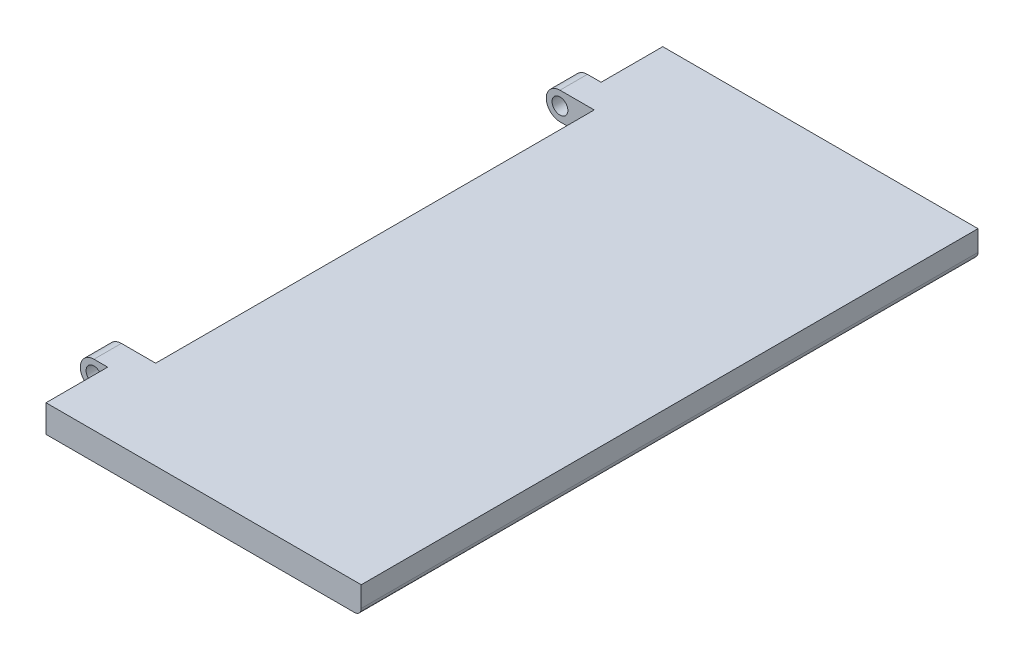
ISO-10303-21;
HEADER;
FILE_DESCRIPTION(('STEP AP214'),'2;1');
FILE_NAME('part.step','',(''),(''),'','','');
FILE_SCHEMA(('AUTOMOTIVE_DESIGN { 1 0 10303 214 1 1 1 1 }'));
ENDSEC;
DATA;
#1=APPLICATION_CONTEXT('core data for automotive mechanical design processes');
#2=APPLICATION_PROTOCOL_DEFINITION('international standard','automotive_design',2000,#1);
#3=PRODUCT_CONTEXT('',#1,'mechanical');
#4=PRODUCT('Part','Part','',(#3));
#5=PRODUCT_RELATED_PRODUCT_CATEGORY('part','',(#4));
#6=PRODUCT_DEFINITION_FORMATION('','',#4);
#7=PRODUCT_DEFINITION_CONTEXT('part definition',#1,'design');
#8=PRODUCT_DEFINITION('design','',#6,#7);
#9=PRODUCT_DEFINITION_SHAPE('','',#8);
#10=(LENGTH_UNIT() NAMED_UNIT(*) SI_UNIT(.MILLI.,.METRE.));
#11=(NAMED_UNIT(*) PLANE_ANGLE_UNIT() SI_UNIT($,.RADIAN.));
#12=(NAMED_UNIT(*) SI_UNIT($,.STERADIAN.) SOLID_ANGLE_UNIT());
#13=UNCERTAINTY_MEASURE_WITH_UNIT(LENGTH_MEASURE(1.E-05),#10,'distance_accuracy_value','');
#14=(GEOMETRIC_REPRESENTATION_CONTEXT(3) GLOBAL_UNCERTAINTY_ASSIGNED_CONTEXT((#13)) GLOBAL_UNIT_ASSIGNED_CONTEXT((#10,
#11,#12)) REPRESENTATION_CONTEXT('',''));
#15=CARTESIAN_POINT('',(0.,0.,0.));
#16=DIRECTION('',(0.,0.,1.));
#17=DIRECTION('',(1.,0.,0.));
#18=AXIS2_PLACEMENT_3D('',#15,#16,#17);
#19=CARTESIAN_POINT('',(0.,0.,90.));
#20=DIRECTION('',(-1.,0.,0.));
#21=DIRECTION('',(0.,0.,1.));
#22=AXIS2_PLACEMENT_3D('',#19,#20,#21);
#23=PLANE('',#22);
#24=DIRECTION('',(0.,-1.,0.));
#25=VECTOR('',#24,1.);
#26=CARTESIAN_POINT('',(0.,4.,77.));
#27=LINE('',#26,#25);
#28=CARTESIAN_POINT('',(0.,0.999999999999998,77.));
#29=VERTEX_POINT('',#28);
#30=CARTESIAN_POINT('',(0.,0.,77.));
#31=VERTEX_POINT('',#30);
#32=EDGE_CURVE('E171',#29,#31,#27,.T.);
#33=ORIENTED_EDGE('',*,*,#32,.F.);
#34=DIRECTION('',(0.,0.,-1.));
#35=VECTOR('',#34,1.);
#36=CARTESIAN_POINT('',(0.,0.999999999999999,90.));
#37=LINE('',#36,#35);
#38=CARTESIAN_POINT('',(0.,0.999999999999998,13.));
#39=VERTEX_POINT('',#38);
#40=EDGE_CURVE('E238',#29,#39,#37,.T.);
#41=ORIENTED_EDGE('',*,*,#40,.T.);
#42=DIRECTION('',(0.,-1.,0.));
#43=VECTOR('',#42,1.);
#44=CARTESIAN_POINT('',(0.,4.,13.));
#45=LINE('',#44,#43);
#46=CARTESIAN_POINT('',(0.,0.,13.));
#47=VERTEX_POINT('',#46);
#48=EDGE_CURVE('E213',#39,#47,#45,.T.);
#49=ORIENTED_EDGE('',*,*,#48,.T.);
#50=DIRECTION('',(0.,0.,-1.));
#51=VECTOR('',#50,1.);
#52=CARTESIAN_POINT('',(0.,0.,90.));
#53=LINE('',#52,#51);
#54=EDGE_CURVE('E180',#31,#47,#53,.T.);
#55=ORIENTED_EDGE('',*,*,#54,.F.);
#56=EDGE_LOOP('',(#33,#41,#49,#55));
#57=FACE_BOUND('',#56,.T.);
#58=ADVANCED_FACE('F37',(#57),#23,.T.);
#59=DIRECTION('',(0.,-1.,0.));
#60=VECTOR('',#59,1.);
#61=CARTESIAN_POINT('',(0.,4.,81.));
#62=LINE('',#61,#60);
#63=CARTESIAN_POINT('',(0.,4.,81.));
#64=VERTEX_POINT('',#63);
#65=CARTESIAN_POINT('',(0.,0.,81.));
#66=VERTEX_POINT('',#65);
#67=EDGE_CURVE('E155',#64,#66,#62,.T.);
#68=ORIENTED_EDGE('',*,*,#67,.T.);
#69=CARTESIAN_POINT('',(0.,0.,90.));
#70=VERTEX_POINT('',#69);
#71=EDGE_CURVE('E168',#70,#66,#53,.T.);
#72=ORIENTED_EDGE('',*,*,#71,.F.);
#73=DIRECTION('',(0.,1.,0.));
#74=VECTOR('',#73,1.);
#75=CARTESIAN_POINT('',(0.,0.,90.));
#76=LINE('',#75,#74);
#77=CARTESIAN_POINT('',(0.,4.,90.));
#78=VERTEX_POINT('',#77);
#79=EDGE_CURVE('E190',#70,#78,#76,.T.);
#80=ORIENTED_EDGE('',*,*,#79,.T.);
#81=DIRECTION('',(0.,0.,-1.));
#82=VECTOR('',#81,1.);
#83=CARTESIAN_POINT('',(0.,4.,90.));
#84=LINE('',#83,#82);
#85=EDGE_CURVE('E170',#78,#64,#84,.T.);
#86=ORIENTED_EDGE('',*,*,#85,.T.);
#87=EDGE_LOOP('',(#68,#72,#80,#86));
#88=FACE_BOUND('',#87,.T.);
#89=ADVANCED_FACE('F166',(#88),#23,.T.);
#90=CARTESIAN_POINT('',(0.,4.,90.));
#91=DIRECTION('',(0.,1.,0.));
#92=DIRECTION('',(0.,0.,1.));
#93=AXIS2_PLACEMENT_3D('',#90,#91,#92);
#94=PLANE('',#93);
#95=DIRECTION('',(1.,0.,0.));
#96=VECTOR('',#95,1.);
#97=CARTESIAN_POINT('',(-4.,4.,13.));
#98=LINE('',#97,#96);
#99=CARTESIAN_POINT('',(-2.,4.,13.));
#100=VERTEX_POINT('',#99);
#101=CARTESIAN_POINT('',(3.00000000000001,4.,13.));
#102=VERTEX_POINT('',#101);
#103=EDGE_CURVE('E53',#100,#102,#98,.T.);
#104=ORIENTED_EDGE('',*,*,#103,.T.);
#105=DIRECTION('',(0.,0.,1.));
#106=VECTOR('',#105,1.);
#107=CARTESIAN_POINT('',(3.00000000000001,4.,90.));
#108=LINE('',#107,#106);
#109=CARTESIAN_POINT('',(3.00000000000001,4.,77.));
#110=VERTEX_POINT('',#109);
#111=EDGE_CURVE('E241',#102,#110,#108,.T.);
#112=ORIENTED_EDGE('',*,*,#111,.T.);
#113=DIRECTION('',(1.,0.,0.));
#114=VECTOR('',#113,1.);
#115=CARTESIAN_POINT('',(-4.,4.,77.));
#116=LINE('',#115,#114);
#117=CARTESIAN_POINT('',(-2.,4.,77.));
#118=VERTEX_POINT('',#117);
#119=EDGE_CURVE('E60',#118,#110,#116,.T.);
#120=ORIENTED_EDGE('',*,*,#119,.F.);
#121=DIRECTION('',(0.,0.,-1.));
#122=VECTOR('',#121,1.);
#123=CARTESIAN_POINT('',(-2.,4.,81.));
#124=LINE('',#123,#122);
#125=CARTESIAN_POINT('',(-2.,4.,81.));
#126=VERTEX_POINT('',#125);
#127=EDGE_CURVE('E218',#118,#126,#124,.F.);
#128=ORIENTED_EDGE('',*,*,#127,.T.);
#129=DIRECTION('',(1.,0.,0.));
#130=VECTOR('',#129,1.);
#131=CARTESIAN_POINT('',(-4.,4.,81.));
#132=LINE('',#131,#130);
#133=EDGE_CURVE('E163',#126,#64,#132,.T.);
#134=ORIENTED_EDGE('',*,*,#133,.T.);
#135=ORIENTED_EDGE('',*,*,#85,.F.);
#136=DIRECTION('',(1.,0.,0.));
#137=VECTOR('',#136,1.);
#138=CARTESIAN_POINT('',(0.,4.,90.));
#139=LINE('',#138,#137);
#140=CARTESIAN_POINT('',(46.,4.,90.));
#141=VERTEX_POINT('',#140);
#142=EDGE_CURVE('E286',#78,#141,#139,.T.);
#143=ORIENTED_EDGE('',*,*,#142,.T.);
#144=DIRECTION('',(0.,0.,-1.));
#145=VECTOR('',#144,1.);
#146=CARTESIAN_POINT('',(46.,4.,90.));
#147=LINE('',#146,#145);
#148=CARTESIAN_POINT('',(46.,4.,0.));
#149=VERTEX_POINT('',#148);
#150=EDGE_CURVE('E186',#141,#149,#147,.T.);
#151=ORIENTED_EDGE('',*,*,#150,.T.);
#152=DIRECTION('',(1.,0.,0.));
#153=VECTOR('',#152,1.);
#154=CARTESIAN_POINT('',(0.,4.,0.));
#155=LINE('',#154,#153);
#156=CARTESIAN_POINT('',(0.,4.,0.));
#157=VERTEX_POINT('',#156);
#158=EDGE_CURVE('E285',#157,#149,#155,.T.);
#159=ORIENTED_EDGE('',*,*,#158,.F.);
#160=CARTESIAN_POINT('',(0.,4.,8.99999999999999));
#161=VERTEX_POINT('',#160);
#162=EDGE_CURVE('E179',#161,#157,#84,.T.);
#163=ORIENTED_EDGE('',*,*,#162,.F.);
#164=DIRECTION('',(1.,0.,0.));
#165=VECTOR('',#164,1.);
#166=CARTESIAN_POINT('',(-4.,4.,8.99999999999999));
#167=LINE('',#166,#165);
#168=CARTESIAN_POINT('',(-2.,4.,8.99999999999999));
#169=VERTEX_POINT('',#168);
#170=EDGE_CURVE('E280',#169,#161,#167,.T.);
#171=ORIENTED_EDGE('',*,*,#170,.F.);
#172=DIRECTION('',(0.,0.,1.));
#173=VECTOR('',#172,1.);
#174=CARTESIAN_POINT('',(-2.,4.,13.));
#175=LINE('',#174,#173);
#176=EDGE_CURVE('E197',#169,#100,#175,.T.);
#177=ORIENTED_EDGE('',*,*,#176,.T.);
#178=EDGE_LOOP('',(#104,#112,#120,#128,#134,#135,#143,#151,#159,#163,#171,#177));
#179=FACE_BOUND('',#178,.T.);
#180=ADVANCED_FACE('F250',(#179),#94,.T.);
#181=DIRECTION('',(0.,-1.,0.));
#182=VECTOR('',#181,1.);
#183=CARTESIAN_POINT('',(0.,4.,8.99999999999999));
#184=LINE('',#183,#182);
#185=CARTESIAN_POINT('',(0.,0.,9.));
#186=VERTEX_POINT('',#185);
#187=EDGE_CURVE('E275',#161,#186,#184,.T.);
#188=ORIENTED_EDGE('',*,*,#187,.F.);
#189=ORIENTED_EDGE('',*,*,#162,.T.);
#190=DIRECTION('',(0.,1.,0.));
#191=VECTOR('',#190,1.);
#192=CARTESIAN_POINT('',(0.,0.,0.));
#193=LINE('',#192,#191);
#194=CARTESIAN_POINT('',(0.,0.,0.));
#195=VERTEX_POINT('',#194);
#196=EDGE_CURVE('E289',#195,#157,#193,.T.);
#197=ORIENTED_EDGE('',*,*,#196,.F.);
#198=EDGE_CURVE('E182',#186,#195,#53,.T.);
#199=ORIENTED_EDGE('',*,*,#198,.F.);
#200=EDGE_LOOP('',(#188,#189,#197,#199));
#201=FACE_BOUND('',#200,.T.);
#202=ADVANCED_FACE('F304',(#201),#23,.T.);
#203=CARTESIAN_POINT('',(0.,0.,90.));
#204=DIRECTION('',(0.,1.,0.));
#205=DIRECTION('',(0.,0.,1.));
#206=AXIS2_PLACEMENT_3D('',#203,#204,#205);
#207=PLANE('',#206);
#208=DIRECTION('',(1.,0.,0.));
#209=VECTOR('',#208,1.);
#210=CARTESIAN_POINT('',(0.,0.,0.));
#211=LINE('',#210,#209);
#212=CARTESIAN_POINT('',(45.,0.,0.));
#213=VERTEX_POINT('',#212);
#214=EDGE_CURVE('E295',#195,#213,#211,.T.);
#215=ORIENTED_EDGE('',*,*,#214,.T.);
#216=DIRECTION('',(0.,0.,-1.));
#217=VECTOR('',#216,1.);
#218=CARTESIAN_POINT('',(45.,0.,90.));
#219=LINE('',#218,#217);
#220=CARTESIAN_POINT('',(45.,0.,90.));
#221=VERTEX_POINT('',#220);
#222=EDGE_CURVE('E234',#213,#221,#219,.F.);
#223=ORIENTED_EDGE('',*,*,#222,.T.);
#224=DIRECTION('',(1.,0.,0.));
#225=VECTOR('',#224,1.);
#226=CARTESIAN_POINT('',(0.,0.,90.));
#227=LINE('',#226,#225);
#228=EDGE_CURVE('E177',#70,#221,#227,.T.);
#229=ORIENTED_EDGE('',*,*,#228,.F.);
#230=ORIENTED_EDGE('',*,*,#71,.T.);
#231=DIRECTION('',(1.,0.,0.));
#232=VECTOR('',#231,1.);
#233=CARTESIAN_POINT('',(-4.,0.,81.));
#234=LINE('',#233,#232);
#235=CARTESIAN_POINT('',(-2.,0.,81.));
#236=VERTEX_POINT('',#235);
#237=EDGE_CURVE('E151',#236,#66,#234,.T.);
#238=ORIENTED_EDGE('',*,*,#237,.F.);
#239=DIRECTION('',(0.,0.,-1.));
#240=VECTOR('',#239,1.);
#241=CARTESIAN_POINT('',(-2.,0.,90.));
#242=LINE('',#241,#240);
#243=CARTESIAN_POINT('',(-2.,0.,77.));
#244=VERTEX_POINT('',#243);
#245=EDGE_CURVE('E224',#236,#244,#242,.T.);
#246=ORIENTED_EDGE('',*,*,#245,.T.);
#247=DIRECTION('',(1.,0.,0.));
#248=VECTOR('',#247,1.);
#249=CARTESIAN_POINT('',(-4.,0.,77.));
#250=LINE('',#249,#248);
#251=EDGE_CURVE('E252',#244,#31,#250,.T.);
#252=ORIENTED_EDGE('',*,*,#251,.T.);
#253=ORIENTED_EDGE('',*,*,#54,.T.);
#254=DIRECTION('',(1.,0.,0.));
#255=VECTOR('',#254,1.);
#256=CARTESIAN_POINT('',(-4.,0.,13.));
#257=LINE('',#256,#255);
#258=CARTESIAN_POINT('',(-2.,0.,13.));
#259=VERTEX_POINT('',#258);
#260=EDGE_CURVE('E283',#259,#47,#257,.T.);
#261=ORIENTED_EDGE('',*,*,#260,.F.);
#262=DIRECTION('',(0.,0.,1.));
#263=VECTOR('',#262,1.);
#264=CARTESIAN_POINT('',(-2.,0.,90.));
#265=LINE('',#264,#263);
#266=CARTESIAN_POINT('',(-2.,0.,9.));
#267=VERTEX_POINT('',#266);
#268=EDGE_CURVE('E207',#259,#267,#265,.F.);
#269=ORIENTED_EDGE('',*,*,#268,.T.);
#270=DIRECTION('',(1.,0.,0.));
#271=VECTOR('',#270,1.);
#272=CARTESIAN_POINT('',(-4.,0.,9.));
#273=LINE('',#272,#271);
#274=EDGE_CURVE('E278',#267,#186,#273,.T.);
#275=ORIENTED_EDGE('',*,*,#274,.T.);
#276=ORIENTED_EDGE('',*,*,#198,.T.);
#277=EDGE_LOOP('',(#215,#223,#229,#230,#238,#246,#252,#253,#261,#269,#275,#276));
#278=FACE_BOUND('',#277,.T.);
#279=ADVANCED_FACE('F175',(#278),#207,.F.);
#280=CARTESIAN_POINT('',(46.,0.,90.));
#281=DIRECTION('',(-1.,0.,0.));
#282=DIRECTION('',(0.,0.,1.));
#283=AXIS2_PLACEMENT_3D('',#280,#281,#282);
#284=PLANE('',#283);
#285=DIRECTION('',(0.,1.,0.));
#286=VECTOR('',#285,1.);
#287=CARTESIAN_POINT('',(46.,0.,90.));
#288=LINE('',#287,#286);
#289=CARTESIAN_POINT('',(46.,1.,90.));
#290=VERTEX_POINT('',#289);
#291=EDGE_CURVE('E288',#290,#141,#288,.T.);
#292=ORIENTED_EDGE('',*,*,#291,.F.);
#293=DIRECTION('',(0.,0.,-1.));
#294=VECTOR('',#293,1.);
#295=CARTESIAN_POINT('',(46.,1.,90.));
#296=LINE('',#295,#294);
#297=CARTESIAN_POINT('',(46.,1.,0.));
#298=VERTEX_POINT('',#297);
#299=EDGE_CURVE('E226',#290,#298,#296,.T.);
#300=ORIENTED_EDGE('',*,*,#299,.T.);
#301=DIRECTION('',(0.,1.,0.));
#302=VECTOR('',#301,1.);
#303=CARTESIAN_POINT('',(46.,0.,0.));
#304=LINE('',#303,#302);
#305=EDGE_CURVE('E293',#298,#149,#304,.T.);
#306=ORIENTED_EDGE('',*,*,#305,.T.);
#307=ORIENTED_EDGE('',*,*,#150,.F.);
#308=EDGE_LOOP('',(#292,#300,#306,#307));
#309=FACE_BOUND('',#308,.T.);
#310=ADVANCED_FACE('F346',(#309),#284,.F.);
#311=CARTESIAN_POINT('',(0.,0.,90.));
#312=DIRECTION('',(0.,0.,1.));
#313=DIRECTION('',(1.,0.,0.));
#314=AXIS2_PLACEMENT_3D('',#311,#312,#313);
#315=PLANE('',#314);
#316=ORIENTED_EDGE('',*,*,#228,.T.);
#317=CARTESIAN_POINT('',(45.,1.,90.));
#318=DIRECTION('',(0.,0.,1.));
#319=DIRECTION('',(1.,0.,0.));
#320=AXIS2_PLACEMENT_3D('',#317,#318,#319);
#321=CIRCLE('',#320,1.);
#322=EDGE_CURVE('E236',#221,#290,#321,.T.);
#323=ORIENTED_EDGE('',*,*,#322,.T.);
#324=ORIENTED_EDGE('',*,*,#291,.T.);
#325=ORIENTED_EDGE('',*,*,#142,.F.);
#326=ORIENTED_EDGE('',*,*,#79,.F.);
#327=EDGE_LOOP('',(#316,#323,#324,#325,#326));
#328=FACE_BOUND('',#327,.T.);
#329=ADVANCED_FACE('F373',(#328),#315,.T.);
#330=CARTESIAN_POINT('',(0.,0.,0.));
#331=DIRECTION('',(0.,0.,1.));
#332=DIRECTION('',(1.,0.,0.));
#333=AXIS2_PLACEMENT_3D('',#330,#331,#332);
#334=PLANE('',#333);
#335=ORIENTED_EDGE('',*,*,#305,.F.);
#336=CARTESIAN_POINT('',(45.,1.,0.));
#337=DIRECTION('',(0.,0.,1.));
#338=DIRECTION('',(1.,0.,0.));
#339=AXIS2_PLACEMENT_3D('',#336,#337,#338);
#340=CIRCLE('',#339,1.);
#341=EDGE_CURVE('E232',#298,#213,#340,.F.);
#342=ORIENTED_EDGE('',*,*,#341,.T.);
#343=ORIENTED_EDGE('',*,*,#214,.F.);
#344=ORIENTED_EDGE('',*,*,#196,.T.);
#345=ORIENTED_EDGE('',*,*,#158,.T.);
#346=EDGE_LOOP('',(#335,#342,#343,#344,#345));
#347=FACE_BOUND('',#346,.T.);
#348=ADVANCED_FACE('F301',(#347),#334,.F.);
#349=CARTESIAN_POINT('',(-4.,4.,13.));
#350=DIRECTION('',(0.,0.,1.));
#351=DIRECTION('',(0.,-1.,0.));
#352=AXIS2_PLACEMENT_3D('',#349,#350,#351);
#353=PLANE('',#352);
#354=CARTESIAN_POINT('',(-2.,2.,13.));
#355=DIRECTION('',(0.,0.,1.));
#356=DIRECTION('',(1.,0.,0.));
#357=AXIS2_PLACEMENT_3D('',#354,#355,#356);
#358=CIRCLE('',#357,1.15);
#359=CARTESIAN_POINT('',(-0.85,2.,13.));
#360=VERTEX_POINT('',#359);
#361=EDGE_CURVE('E162',#360,#360,#358,.T.);
#362=ORIENTED_EDGE('',*,*,#361,.F.);
#363=EDGE_LOOP('',(#362));
#364=FACE_BOUND('',#363,.T.);
#365=ORIENTED_EDGE('',*,*,#103,.F.);
#366=CARTESIAN_POINT('',(-2.,2.,13.));
#367=DIRECTION('',(0.,0.,1.));
#368=DIRECTION('',(0.,-1.,0.));
#369=AXIS2_PLACEMENT_3D('',#366,#367,#368);
#370=CIRCLE('',#369,2.);
#371=CARTESIAN_POINT('',(-4.,2.,13.));
#372=VERTEX_POINT('',#371);
#373=EDGE_CURVE('E201',#100,#372,#370,.T.);
#374=ORIENTED_EDGE('',*,*,#373,.T.);
#375=CARTESIAN_POINT('',(-2.,2.,13.));
#376=DIRECTION('',(0.,0.,1.));
#377=DIRECTION('',(0.,-1.,0.));
#378=AXIS2_PLACEMENT_3D('',#375,#376,#377);
#379=CIRCLE('',#378,2.);
#380=EDGE_CURVE('E199',#372,#259,#379,.T.);
#381=ORIENTED_EDGE('',*,*,#380,.T.);
#382=ORIENTED_EDGE('',*,*,#260,.T.);
#383=ORIENTED_EDGE('',*,*,#48,.F.);
#384=DIRECTION('',(-0.707106781186549,-0.707106781186546,0.));
#385=VECTOR('',#384,1.);
#386=CARTESIAN_POINT('',(0.,1.00000000000003,13.));
#387=LINE('',#386,#385);
#388=EDGE_CURVE('E46',#39,#102,#387,.F.);
#389=ORIENTED_EDGE('',*,*,#388,.T.);
#390=EDGE_LOOP('',(#365,#374,#381,#382,#383,#389));
#391=FACE_BOUND('',#390,.T.);
#392=ADVANCED_FACE('F245',(#364,#391),#353,.T.);
#393=CARTESIAN_POINT('',(-4.,4.,8.99999999999999));
#394=DIRECTION('',(0.,0.,1.));
#395=DIRECTION('',(0.,-1.,0.));
#396=AXIS2_PLACEMENT_3D('',#393,#394,#395);
#397=PLANE('',#396);
#398=CARTESIAN_POINT('',(-2.,2.,9.));
#399=DIRECTION('',(0.,0.,1.));
#400=DIRECTION('',(0.,-1.,0.));
#401=AXIS2_PLACEMENT_3D('',#398,#399,#400);
#402=CIRCLE('',#401,1.15);
#403=CARTESIAN_POINT('',(-2.,0.85,9.));
#404=VERTEX_POINT('',#403);
#405=EDGE_CURVE('E214',#404,#404,#402,.F.);
#406=ORIENTED_EDGE('',*,*,#405,.F.);
#407=EDGE_LOOP('',(#406));
#408=FACE_BOUND('',#407,.T.);
#409=CARTESIAN_POINT('',(-2.,2.,9.));
#410=DIRECTION('',(0.,0.,1.));
#411=DIRECTION('',(0.,-1.,0.));
#412=AXIS2_PLACEMENT_3D('',#409,#410,#411);
#413=CIRCLE('',#412,2.);
#414=CARTESIAN_POINT('',(-4.,2.,9.));
#415=VERTEX_POINT('',#414);
#416=EDGE_CURVE('E203',#267,#415,#413,.F.);
#417=ORIENTED_EDGE('',*,*,#416,.T.);
#418=CARTESIAN_POINT('',(-2.,2.,8.99999999999999));
#419=DIRECTION('',(0.,0.,1.));
#420=DIRECTION('',(0.,-1.,0.));
#421=AXIS2_PLACEMENT_3D('',#418,#419,#420);
#422=CIRCLE('',#421,2.);
#423=EDGE_CURVE('E205',#415,#169,#422,.F.);
#424=ORIENTED_EDGE('',*,*,#423,.T.);
#425=ORIENTED_EDGE('',*,*,#170,.T.);
#426=ORIENTED_EDGE('',*,*,#187,.T.);
#427=ORIENTED_EDGE('',*,*,#274,.F.);
#428=EDGE_LOOP('',(#417,#424,#425,#426,#427));
#429=FACE_BOUND('',#428,.T.);
#430=ADVANCED_FACE('F320',(#408,#429),#397,.F.);
#431=CARTESIAN_POINT('',(-2.,2.,0.));
#432=DIRECTION('',(0.,0.,1.));
#433=DIRECTION('',(1.,0.,0.));
#434=AXIS2_PLACEMENT_3D('',#431,#432,#433);
#435=CYLINDRICAL_SURFACE('',#434,2.);
#436=DIRECTION('',(0.,0.,1.));
#437=VECTOR('',#436,1.);
#438=CARTESIAN_POINT('',(-4.,2.,0.));
#439=LINE('',#438,#437);
#440=EDGE_CURVE('E210',#415,#372,#439,.T.);
#441=ORIENTED_EDGE('',*,*,#440,.F.);
#442=ORIENTED_EDGE('',*,*,#416,.F.);
#443=ORIENTED_EDGE('',*,*,#268,.F.);
#444=ORIENTED_EDGE('',*,*,#380,.F.);
#445=EDGE_LOOP('',(#441,#442,#443,#444));
#446=FACE_BOUND('',#445,.T.);
#447=ADVANCED_FACE('F317',(#446),#435,.T.);
#448=CARTESIAN_POINT('',(-2.,2.,90.));
#449=DIRECTION('',(0.,0.,-1.));
#450=DIRECTION('',(-1.,0.,0.));
#451=AXIS2_PLACEMENT_3D('',#448,#449,#450);
#452=CYLINDRICAL_SURFACE('',#451,2.);
#453=ORIENTED_EDGE('',*,*,#423,.F.);
#454=ORIENTED_EDGE('',*,*,#440,.T.);
#455=ORIENTED_EDGE('',*,*,#373,.F.);
#456=ORIENTED_EDGE('',*,*,#176,.F.);
#457=EDGE_LOOP('',(#453,#454,#455,#456));
#458=FACE_BOUND('',#457,.T.);
#459=ADVANCED_FACE('F311',(#458),#452,.T.);
#460=CARTESIAN_POINT('',(-2.,2.,-0.000999999999999265));
#461=DIRECTION('',(0.,0.,1.));
#462=DIRECTION('',(1.,0.,0.));
#463=AXIS2_PLACEMENT_3D('',#460,#461,#462);
#464=CYLINDRICAL_SURFACE('',#463,1.15);
#465=ORIENTED_EDGE('',*,*,#361,.T.);
#466=EDGE_LOOP('',(#465));
#467=FACE_BOUND('',#466,.T.);
#468=ORIENTED_EDGE('',*,*,#405,.T.);
#469=EDGE_LOOP('',(#468));
#470=FACE_BOUND('',#469,.T.);
#471=ADVANCED_FACE('F353',(#467,#470),#464,.F.);
#472=CARTESIAN_POINT('',(-4.,4.,81.));
#473=DIRECTION('',(0.,0.,1.));
#474=DIRECTION('',(0.,-1.,0.));
#475=AXIS2_PLACEMENT_3D('',#472,#473,#474);
#476=PLANE('',#475);
#477=CARTESIAN_POINT('',(-2.,2.,81.));
#478=DIRECTION('',(0.,0.,1.));
#479=DIRECTION('',(0.,-1.,0.));
#480=AXIS2_PLACEMENT_3D('',#477,#478,#479);
#481=CIRCLE('',#480,1.15);
#482=CARTESIAN_POINT('',(-2.,0.85,81.));
#483=VERTEX_POINT('',#482);
#484=EDGE_CURVE('E229',#483,#483,#481,.T.);
#485=ORIENTED_EDGE('',*,*,#484,.F.);
#486=EDGE_LOOP('',(#485));
#487=FACE_BOUND('',#486,.T.);
#488=ORIENTED_EDGE('',*,*,#133,.F.);
#489=CARTESIAN_POINT('',(-2.,2.,81.));
#490=DIRECTION('',(0.,0.,1.));
#491=DIRECTION('',(0.,-1.,0.));
#492=AXIS2_PLACEMENT_3D('',#489,#490,#491);
#493=CIRCLE('',#492,2.);
#494=CARTESIAN_POINT('',(-4.,2.,81.));
#495=VERTEX_POINT('',#494);
#496=EDGE_CURVE('E222',#126,#495,#493,.T.);
#497=ORIENTED_EDGE('',*,*,#496,.T.);
#498=CARTESIAN_POINT('',(-2.,2.,81.));
#499=DIRECTION('',(0.,0.,1.));
#500=DIRECTION('',(0.,-1.,0.));
#501=AXIS2_PLACEMENT_3D('',#498,#499,#500);
#502=CIRCLE('',#501,2.);
#503=EDGE_CURVE('E158',#495,#236,#502,.T.);
#504=ORIENTED_EDGE('',*,*,#503,.T.);
#505=ORIENTED_EDGE('',*,*,#237,.T.);
#506=ORIENTED_EDGE('',*,*,#67,.F.);
#507=EDGE_LOOP('',(#488,#497,#504,#505,#506));
#508=FACE_BOUND('',#507,.T.);
#509=ADVANCED_FACE('F154',(#487,#508),#476,.T.);
#510=CARTESIAN_POINT('',(-4.,4.,77.));
#511=DIRECTION('',(0.,0.,1.));
#512=DIRECTION('',(0.,-1.,0.));
#513=AXIS2_PLACEMENT_3D('',#510,#511,#512);
#514=PLANE('',#513);
#515=CARTESIAN_POINT('',(-2.,2.,77.));
#516=DIRECTION('',(0.,0.,1.));
#517=DIRECTION('',(1.,0.,0.));
#518=AXIS2_PLACEMENT_3D('',#515,#516,#517);
#519=CIRCLE('',#518,1.15);
#520=CARTESIAN_POINT('',(-0.85,2.,77.));
#521=VERTEX_POINT('',#520);
#522=EDGE_CURVE('E512',#521,#521,#519,.T.);
#523=ORIENTED_EDGE('',*,*,#522,.T.);
#524=EDGE_LOOP('',(#523));
#525=FACE_BOUND('',#524,.T.);
#526=CARTESIAN_POINT('',(-2.,2.,77.));
#527=DIRECTION('',(0.,0.,1.));
#528=DIRECTION('',(0.,-1.,0.));
#529=AXIS2_PLACEMENT_3D('',#526,#527,#528);
#530=CIRCLE('',#529,2.);
#531=CARTESIAN_POINT('',(-4.,2.,77.));
#532=VERTEX_POINT('',#531);
#533=EDGE_CURVE('E209',#244,#532,#530,.F.);
#534=ORIENTED_EDGE('',*,*,#533,.T.);
#535=CARTESIAN_POINT('',(-2.,2.,77.));
#536=DIRECTION('',(0.,0.,1.));
#537=DIRECTION('',(0.,-1.,0.));
#538=AXIS2_PLACEMENT_3D('',#535,#536,#537);
#539=CIRCLE('',#538,2.);
#540=EDGE_CURVE('E216',#532,#118,#539,.F.);
#541=ORIENTED_EDGE('',*,*,#540,.T.);
#542=ORIENTED_EDGE('',*,*,#119,.T.);
#543=DIRECTION('',(0.707106781186549,0.707106781186546,0.));
#544=VECTOR('',#543,1.);
#545=CARTESIAN_POINT('',(-0.500000000000008,0.499999999999992,77.));
#546=LINE('',#545,#544);
#547=EDGE_CURVE('E11',#110,#29,#546,.F.);
#548=ORIENTED_EDGE('',*,*,#547,.T.);
#549=ORIENTED_EDGE('',*,*,#32,.T.);
#550=ORIENTED_EDGE('',*,*,#251,.F.);
#551=EDGE_LOOP('',(#534,#541,#542,#548,#549,#550));
#552=FACE_BOUND('',#551,.T.);
#553=ADVANCED_FACE('F264',(#525,#552),#514,.F.);
#554=CARTESIAN_POINT('',(-2.,2.,90.));
#555=DIRECTION('',(0.,0.,-1.));
#556=DIRECTION('',(-1.,0.,0.));
#557=AXIS2_PLACEMENT_3D('',#554,#555,#556);
#558=CYLINDRICAL_SURFACE('',#557,2.);
#559=ORIENTED_EDGE('',*,*,#245,.F.);
#560=ORIENTED_EDGE('',*,*,#503,.F.);
#561=DIRECTION('',(0.,0.,-1.));
#562=VECTOR('',#561,1.);
#563=CARTESIAN_POINT('',(-4.,2.,90.));
#564=LINE('',#563,#562);
#565=EDGE_CURVE('E172',#532,#495,#564,.F.);
#566=ORIENTED_EDGE('',*,*,#565,.F.);
#567=ORIENTED_EDGE('',*,*,#533,.F.);
#568=EDGE_LOOP('',(#559,#560,#566,#567));
#569=FACE_BOUND('',#568,.T.);
#570=ADVANCED_FACE('F259',(#569),#558,.T.);
#571=CARTESIAN_POINT('',(-2.,2.,90.));
#572=DIRECTION('',(0.,0.,1.));
#573=DIRECTION('',(1.,0.,0.));
#574=AXIS2_PLACEMENT_3D('',#571,#572,#573);
#575=CYLINDRICAL_SURFACE('',#574,2.);
#576=ORIENTED_EDGE('',*,*,#496,.F.);
#577=ORIENTED_EDGE('',*,*,#127,.F.);
#578=ORIENTED_EDGE('',*,*,#540,.F.);
#579=ORIENTED_EDGE('',*,*,#565,.T.);
#580=EDGE_LOOP('',(#576,#577,#578,#579));
#581=FACE_BOUND('',#580,.T.);
#582=ADVANCED_FACE('F256',(#581),#575,.T.);
#583=CARTESIAN_POINT('',(-2.,2.,90.001));
#584=DIRECTION('',(0.,0.,-1.));
#585=DIRECTION('',(-1.,0.,0.));
#586=AXIS2_PLACEMENT_3D('',#583,#584,#585);
#587=CYLINDRICAL_SURFACE('',#586,1.15);
#588=ORIENTED_EDGE('',*,*,#484,.T.);
#589=EDGE_LOOP('',(#588));
#590=FACE_BOUND('',#589,.T.);
#591=ORIENTED_EDGE('',*,*,#522,.F.);
#592=EDGE_LOOP('',(#591));
#593=FACE_BOUND('',#592,.T.);
#594=ADVANCED_FACE('F357',(#590,#593),#587,.F.);
#595=CARTESIAN_POINT('',(45.,1.,90.));
#596=DIRECTION('',(0.,0.,-1.));
#597=DIRECTION('',(-1.,0.,0.));
#598=AXIS2_PLACEMENT_3D('',#595,#596,#597);
#599=CYLINDRICAL_SURFACE('',#598,1.);
#600=ORIENTED_EDGE('',*,*,#322,.F.);
#601=ORIENTED_EDGE('',*,*,#222,.F.);
#602=ORIENTED_EDGE('',*,*,#341,.F.);
#603=ORIENTED_EDGE('',*,*,#299,.F.);
#604=EDGE_LOOP('',(#600,#601,#602,#603));
#605=FACE_BOUND('',#604,.T.);
#606=ADVANCED_FACE('F359',(#605),#599,.T.);
#607=CARTESIAN_POINT('',(0.,0.999999999999999,90.));
#608=DIRECTION('',(0.707106781186546,-0.707106781186549,0.));
#609=DIRECTION('',(0.,0.,-1.));
#610=AXIS2_PLACEMENT_3D('',#607,#608,#609);
#611=PLANE('',#610);
#612=ORIENTED_EDGE('',*,*,#547,.F.);
#613=ORIENTED_EDGE('',*,*,#111,.F.);
#614=ORIENTED_EDGE('',*,*,#388,.F.);
#615=ORIENTED_EDGE('',*,*,#40,.F.);
#616=EDGE_LOOP('',(#612,#613,#614,#615));
#617=FACE_BOUND('',#616,.T.);
#618=ADVANCED_FACE('F40',(#617),#611,.F.);
#619=CLOSED_SHELL('',(#58,#89,#180,#202,#279,#310,#329,#348,#392,#430,#447,#459,#471,#509,#553,
#570,#582,#594,#606,#618));
#620=MANIFOLD_SOLID_BREP('B2',#619);
#621=ADVANCED_BREP_SHAPE_REPRESENTATION('',(#18,#620),#14);
#622=SHAPE_DEFINITION_REPRESENTATION(#9,#621);
ENDSEC;
END-ISO-10303-21;
